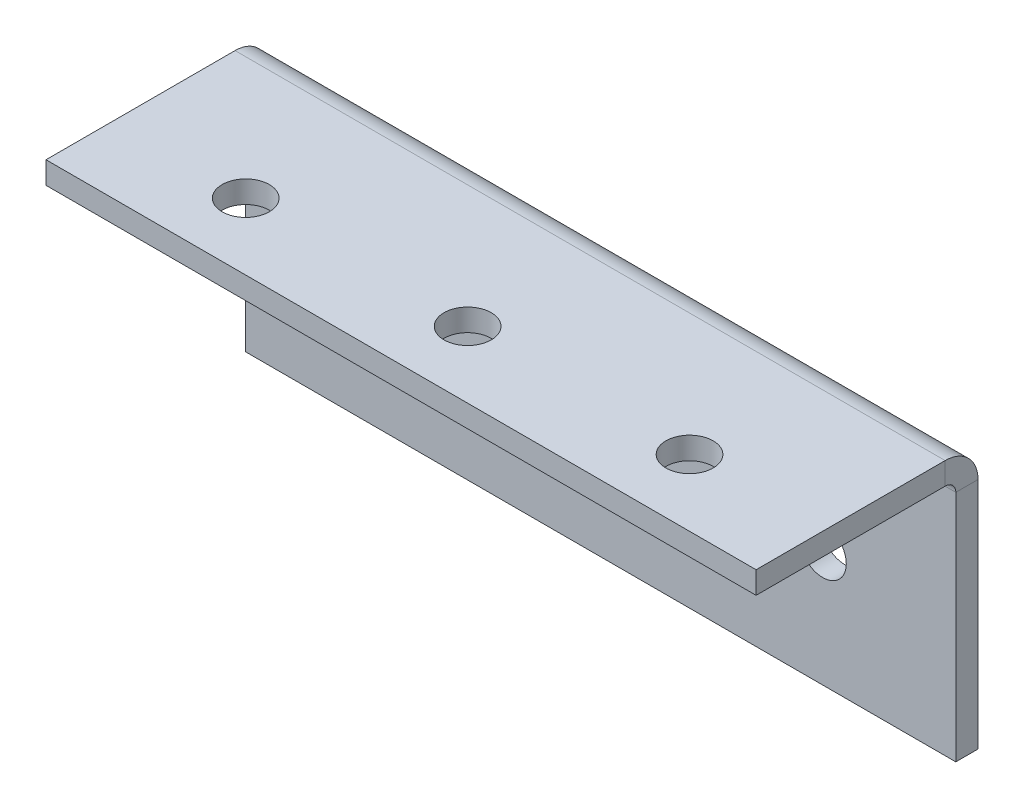
ISO-10303-21;
HEADER;
FILE_DESCRIPTION(('STEP AP214'),'2;1');
FILE_NAME('part.step','',(''),(''),'','','');
FILE_SCHEMA(('AUTOMOTIVE_DESIGN { 1 0 10303 214 1 1 1 1 }'));
ENDSEC;
DATA;
#1=APPLICATION_CONTEXT('core data for automotive mechanical design processes');
#2=APPLICATION_PROTOCOL_DEFINITION('international standard','automotive_design',2000,#1);
#3=PRODUCT_CONTEXT('',#1,'mechanical');
#4=PRODUCT('Part','Part','',(#3));
#5=PRODUCT_RELATED_PRODUCT_CATEGORY('part','',(#4));
#6=PRODUCT_DEFINITION_FORMATION('','',#4);
#7=PRODUCT_DEFINITION_CONTEXT('part definition',#1,'design');
#8=PRODUCT_DEFINITION('design','',#6,#7);
#9=PRODUCT_DEFINITION_SHAPE('','',#8);
#10=(LENGTH_UNIT() NAMED_UNIT(*) SI_UNIT(.MILLI.,.METRE.));
#11=(NAMED_UNIT(*) PLANE_ANGLE_UNIT() SI_UNIT($,.RADIAN.));
#12=(NAMED_UNIT(*) SI_UNIT($,.STERADIAN.) SOLID_ANGLE_UNIT());
#13=UNCERTAINTY_MEASURE_WITH_UNIT(LENGTH_MEASURE(1.E-05),#10,'distance_accuracy_value','');
#14=(GEOMETRIC_REPRESENTATION_CONTEXT(3) GLOBAL_UNCERTAINTY_ASSIGNED_CONTEXT((#13)) GLOBAL_UNIT_ASSIGNED_CONTEXT((#10,
#11,#12)) REPRESENTATION_CONTEXT('',''));
#15=CARTESIAN_POINT('',(0.,0.,0.));
#16=DIRECTION('',(0.,0.,1.));
#17=DIRECTION('',(1.,0.,0.));
#18=AXIS2_PLACEMENT_3D('',#15,#16,#17);
#19=CARTESIAN_POINT('',(0.,0.,-3.175));
#20=DIRECTION('',(-1.,0.,0.));
#21=DIRECTION('',(0.,-1.,0.));
#22=AXIS2_PLACEMENT_3D('',#19,#20,#21);
#23=PLANE('',#22);
#24=DIRECTION('',(0.,-1.,0.));
#25=VECTOR('',#24,1.);
#26=CARTESIAN_POINT('',(0.,0.,0.));
#27=LINE('',#26,#25);
#28=CARTESIAN_POINT('',(0.,33.401,0.));
#29=VERTEX_POINT('',#28);
#30=CARTESIAN_POINT('',(0.,0.,0.));
#31=VERTEX_POINT('',#30);
#32=EDGE_CURVE('E113',#29,#31,#27,.T.);
#33=ORIENTED_EDGE('',*,*,#32,.F.);
#34=DIRECTION('',(0.,0.,-1.));
#35=VECTOR('',#34,1.);
#36=CARTESIAN_POINT('',(0.,33.401,0.));
#37=LINE('',#36,#35);
#38=CARTESIAN_POINT('',(0.,33.401,-3.17499999999999));
#39=VERTEX_POINT('',#38);
#40=EDGE_CURVE('E122',#29,#39,#37,.T.);
#41=ORIENTED_EDGE('',*,*,#40,.T.);
#42=DIRECTION('',(0.,-1.,0.));
#43=VECTOR('',#42,1.);
#44=CARTESIAN_POINT('',(0.,0.,-3.175));
#45=LINE('',#44,#43);
#46=CARTESIAN_POINT('',(0.,0.,-3.175));
#47=VERTEX_POINT('',#46);
#48=EDGE_CURVE('E109',#39,#47,#45,.T.);
#49=ORIENTED_EDGE('',*,*,#48,.T.);
#50=DIRECTION('',(0.,0.,1.));
#51=VECTOR('',#50,1.);
#52=CARTESIAN_POINT('',(0.,0.,-3.175));
#53=LINE('',#52,#51);
#54=EDGE_CURVE('E64',#47,#31,#53,.T.);
#55=ORIENTED_EDGE('',*,*,#54,.T.);
#56=EDGE_LOOP('',(#33,#41,#49,#55));
#57=FACE_BOUND('',#56,.T.);
#58=ADVANCED_FACE('F61',(#57),#23,.T.);
#59=CARTESIAN_POINT('',(0.,0.,-3.175));
#60=DIRECTION('',(0.,0.,-1.));
#61=DIRECTION('',(-1.,0.,0.));
#62=AXIS2_PLACEMENT_3D('',#59,#60,#61);
#63=PLANE('',#62);
#64=CARTESIAN_POINT('',(82.55,16.7005,-3.175));
#65=DIRECTION('',(0.,0.,-1.));
#66=DIRECTION('',(-1.,0.,0.));
#67=AXIS2_PLACEMENT_3D('',#64,#65,#66);
#68=CIRCLE('',#67,3.37819999999999);
#69=CARTESIAN_POINT('',(79.1718,16.7005,-3.175));
#70=VERTEX_POINT('',#69);
#71=EDGE_CURVE('E207',#70,#70,#68,.T.);
#72=ORIENTED_EDGE('',*,*,#71,.F.);
#73=EDGE_LOOP('',(#72));
#74=FACE_BOUND('',#73,.T.);
#75=CARTESIAN_POINT('',(50.8,16.7005,-3.175));
#76=DIRECTION('',(0.,0.,-1.));
#77=DIRECTION('',(-1.,0.,0.));
#78=AXIS2_PLACEMENT_3D('',#75,#76,#77);
#79=CIRCLE('',#78,3.37819999999999);
#80=CARTESIAN_POINT('',(47.4218,16.7005,-3.175));
#81=VERTEX_POINT('',#80);
#82=EDGE_CURVE('E201',#81,#81,#79,.T.);
#83=ORIENTED_EDGE('',*,*,#82,.F.);
#84=EDGE_LOOP('',(#83));
#85=FACE_BOUND('',#84,.T.);
#86=CARTESIAN_POINT('',(19.05,16.7005,-3.175));
#87=DIRECTION('',(0.,0.,-1.));
#88=DIRECTION('',(-1.,0.,0.));
#89=AXIS2_PLACEMENT_3D('',#86,#87,#88);
#90=CIRCLE('',#89,3.37819999999999);
#91=CARTESIAN_POINT('',(15.6718,16.7005,-3.175));
#92=VERTEX_POINT('',#91);
#93=EDGE_CURVE('E195',#92,#92,#90,.T.);
#94=ORIENTED_EDGE('',*,*,#93,.F.);
#95=EDGE_LOOP('',(#94));
#96=FACE_BOUND('',#95,.T.);
#97=ORIENTED_EDGE('',*,*,#48,.F.);
#98=DIRECTION('',(-1.,0.,0.));
#99=VECTOR('',#98,1.);
#100=CARTESIAN_POINT('',(0.,33.401,-3.17499999999999));
#101=LINE('',#100,#99);
#102=CARTESIAN_POINT('',(101.6,33.401,-3.175));
#103=VERTEX_POINT('',#102);
#104=EDGE_CURVE('E139',#39,#103,#101,.F.);
#105=ORIENTED_EDGE('',*,*,#104,.T.);
#106=DIRECTION('',(0.,1.,0.));
#107=VECTOR('',#106,1.);
#108=CARTESIAN_POINT('',(101.6,0.,-3.175));
#109=LINE('',#108,#107);
#110=CARTESIAN_POINT('',(101.6,0.,-3.175));
#111=VERTEX_POINT('',#110);
#112=EDGE_CURVE('E118',#111,#103,#109,.T.);
#113=ORIENTED_EDGE('',*,*,#112,.F.);
#114=DIRECTION('',(1.,0.,0.));
#115=VECTOR('',#114,1.);
#116=CARTESIAN_POINT('',(0.,0.,-3.175));
#117=LINE('',#116,#115);
#118=EDGE_CURVE('E100',#47,#111,#117,.T.);
#119=ORIENTED_EDGE('',*,*,#118,.F.);
#120=EDGE_LOOP('',(#97,#105,#113,#119));
#121=FACE_BOUND('',#120,.T.);
#122=ADVANCED_FACE('F219',(#74,#85,#96,#121),#63,.T.);
#123=CARTESIAN_POINT('',(0.,0.,0.));
#124=DIRECTION('',(0.,0.,-1.));
#125=DIRECTION('',(-1.,0.,0.));
#126=AXIS2_PLACEMENT_3D('',#123,#124,#125);
#127=PLANE('',#126);
#128=CARTESIAN_POINT('',(82.55,16.7005,0.));
#129=DIRECTION('',(0.,0.,1.));
#130=DIRECTION('',(1.,0.,0.));
#131=AXIS2_PLACEMENT_3D('',#128,#129,#130);
#132=CIRCLE('',#131,3.37819999999998);
#133=CARTESIAN_POINT('',(85.9282,16.7005,0.));
#134=VERTEX_POINT('',#133);
#135=EDGE_CURVE('E210',#134,#134,#132,.T.);
#136=ORIENTED_EDGE('',*,*,#135,.F.);
#137=EDGE_LOOP('',(#136));
#138=FACE_BOUND('',#137,.T.);
#139=CARTESIAN_POINT('',(50.8,16.7005,0.));
#140=DIRECTION('',(0.,0.,1.));
#141=DIRECTION('',(1.,0.,0.));
#142=AXIS2_PLACEMENT_3D('',#139,#140,#141);
#143=CIRCLE('',#142,3.37819999999998);
#144=CARTESIAN_POINT('',(54.1782,16.7005,0.));
#145=VERTEX_POINT('',#144);
#146=EDGE_CURVE('E204',#145,#145,#143,.T.);
#147=ORIENTED_EDGE('',*,*,#146,.F.);
#148=EDGE_LOOP('',(#147));
#149=FACE_BOUND('',#148,.T.);
#150=CARTESIAN_POINT('',(19.05,16.7005,0.));
#151=DIRECTION('',(0.,0.,1.));
#152=DIRECTION('',(1.,0.,0.));
#153=AXIS2_PLACEMENT_3D('',#150,#151,#152);
#154=CIRCLE('',#153,3.37819999999999);
#155=CARTESIAN_POINT('',(22.4282,16.7005,0.));
#156=VERTEX_POINT('',#155);
#157=EDGE_CURVE('E198',#156,#156,#154,.T.);
#158=ORIENTED_EDGE('',*,*,#157,.F.);
#159=EDGE_LOOP('',(#158));
#160=FACE_BOUND('',#159,.T.);
#161=DIRECTION('',(-1.,0.,0.));
#162=VECTOR('',#161,1.);
#163=CARTESIAN_POINT('',(0.,33.401,0.));
#164=LINE('',#163,#162);
#165=CARTESIAN_POINT('',(101.6,33.401,0.));
#166=VERTEX_POINT('',#165);
#167=EDGE_CURVE('E129',#29,#166,#164,.F.);
#168=ORIENTED_EDGE('',*,*,#167,.F.);
#169=ORIENTED_EDGE('',*,*,#32,.T.);
#170=DIRECTION('',(1.,0.,0.));
#171=VECTOR('',#170,1.);
#172=CARTESIAN_POINT('',(0.,0.,0.));
#173=LINE('',#172,#171);
#174=CARTESIAN_POINT('',(101.6,0.,0.));
#175=VERTEX_POINT('',#174);
#176=EDGE_CURVE('E98',#31,#175,#173,.T.);
#177=ORIENTED_EDGE('',*,*,#176,.T.);
#178=DIRECTION('',(0.,1.,0.));
#179=VECTOR('',#178,1.);
#180=CARTESIAN_POINT('',(101.6,0.,0.));
#181=LINE('',#180,#179);
#182=EDGE_CURVE('E103',#175,#166,#181,.T.);
#183=ORIENTED_EDGE('',*,*,#182,.T.);
#184=EDGE_LOOP('',(#168,#169,#177,#183));
#185=FACE_BOUND('',#184,.T.);
#186=ADVANCED_FACE('F111',(#138,#149,#160,#185),#127,.F.);
#187=CARTESIAN_POINT('',(101.6,0.,-3.175));
#188=DIRECTION('',(1.,0.,0.));
#189=DIRECTION('',(0.,1.,0.));
#190=AXIS2_PLACEMENT_3D('',#187,#188,#189);
#191=PLANE('',#190);
#192=DIRECTION('',(0.,0.,-1.));
#193=VECTOR('',#192,1.);
#194=CARTESIAN_POINT('',(101.6,33.401,0.));
#195=LINE('',#194,#193);
#196=EDGE_CURVE('E106',#166,#103,#195,.T.);
#197=ORIENTED_EDGE('',*,*,#196,.F.);
#198=ORIENTED_EDGE('',*,*,#182,.F.);
#199=DIRECTION('',(0.,0.,1.));
#200=VECTOR('',#199,1.);
#201=CARTESIAN_POINT('',(101.6,0.,-3.175));
#202=LINE('',#201,#200);
#203=EDGE_CURVE('E13',#111,#175,#202,.T.);
#204=ORIENTED_EDGE('',*,*,#203,.F.);
#205=ORIENTED_EDGE('',*,*,#112,.T.);
#206=EDGE_LOOP('',(#197,#198,#204,#205));
#207=FACE_BOUND('',#206,.T.);
#208=ADVANCED_FACE('F104',(#207),#191,.T.);
#209=CARTESIAN_POINT('',(0.,0.,-3.175));
#210=DIRECTION('',(0.,-1.,0.));
#211=DIRECTION('',(0.,0.,-1.));
#212=AXIS2_PLACEMENT_3D('',#209,#210,#211);
#213=PLANE('',#212);
#214=ORIENTED_EDGE('',*,*,#176,.F.);
#215=ORIENTED_EDGE('',*,*,#54,.F.);
#216=ORIENTED_EDGE('',*,*,#118,.T.);
#217=ORIENTED_EDGE('',*,*,#203,.T.);
#218=EDGE_LOOP('',(#214,#215,#216,#217));
#219=FACE_BOUND('',#218,.T.);
#220=ADVANCED_FACE('F95',(#219),#213,.T.);
#221=CARTESIAN_POINT('',(101.6,33.401,1.524));
#222=DIRECTION('',(1.,0.,0.));
#223=DIRECTION('',(0.,0.,-1.));
#224=AXIS2_PLACEMENT_3D('',#221,#222,#223);
#225=PLANE('',#224);
#226=DIRECTION('',(0.,-1.,0.));
#227=VECTOR('',#226,1.);
#228=CARTESIAN_POINT('',(101.6,38.1,1.52399999999999));
#229=LINE('',#228,#227);
#230=CARTESIAN_POINT('',(101.6,34.925,1.524));
#231=VERTEX_POINT('',#230);
#232=CARTESIAN_POINT('',(101.6,38.1,1.52399999999999));
#233=VERTEX_POINT('',#232);
#234=EDGE_CURVE('E143',#231,#233,#229,.F.);
#235=ORIENTED_EDGE('',*,*,#234,.F.);
#236=CARTESIAN_POINT('',(101.6,33.401,1.524));
#237=DIRECTION('',(-1.,0.,0.));
#238=DIRECTION('',(0.,0.,1.));
#239=AXIS2_PLACEMENT_3D('',#236,#237,#238);
#240=CIRCLE('',#239,1.524);
#241=EDGE_CURVE('E133',#166,#231,#240,.F.);
#242=ORIENTED_EDGE('',*,*,#241,.F.);
#243=ORIENTED_EDGE('',*,*,#196,.T.);
#244=CARTESIAN_POINT('',(101.6,33.401,1.524));
#245=DIRECTION('',(-1.,0.,0.));
#246=DIRECTION('',(0.,0.,1.));
#247=AXIS2_PLACEMENT_3D('',#244,#245,#246);
#248=CIRCLE('',#247,4.699);
#249=EDGE_CURVE('E75',#103,#233,#248,.F.);
#250=ORIENTED_EDGE('',*,*,#249,.T.);
#251=EDGE_LOOP('',(#235,#242,#243,#250));
#252=FACE_BOUND('',#251,.T.);
#253=ADVANCED_FACE('F286',(#252),#225,.T.);
#254=CARTESIAN_POINT('',(0.,33.401,1.524));
#255=DIRECTION('',(1.,0.,0.));
#256=DIRECTION('',(0.,0.,-1.));
#257=AXIS2_PLACEMENT_3D('',#254,#255,#256);
#258=PLANE('',#257);
#259=CARTESIAN_POINT('',(0.,33.401,1.524));
#260=DIRECTION('',(-1.,0.,0.));
#261=DIRECTION('',(0.,0.,1.));
#262=AXIS2_PLACEMENT_3D('',#259,#260,#261);
#263=CIRCLE('',#262,1.524);
#264=CARTESIAN_POINT('',(0.,34.925,1.524));
#265=VERTEX_POINT('',#264);
#266=EDGE_CURVE('E126',#265,#29,#263,.T.);
#267=ORIENTED_EDGE('',*,*,#266,.F.);
#268=DIRECTION('',(0.,-1.,0.));
#269=VECTOR('',#268,1.);
#270=CARTESIAN_POINT('',(0.,34.925,1.524));
#271=LINE('',#270,#269);
#272=CARTESIAN_POINT('',(0.,38.1,1.52399999999999));
#273=VERTEX_POINT('',#272);
#274=EDGE_CURVE('E150',#265,#273,#271,.F.);
#275=ORIENTED_EDGE('',*,*,#274,.T.);
#276=CARTESIAN_POINT('',(0.,33.401,1.524));
#277=DIRECTION('',(-1.,0.,0.));
#278=DIRECTION('',(0.,0.,1.));
#279=AXIS2_PLACEMENT_3D('',#276,#277,#278);
#280=CIRCLE('',#279,4.699);
#281=EDGE_CURVE('E136',#273,#39,#280,.T.);
#282=ORIENTED_EDGE('',*,*,#281,.T.);
#283=ORIENTED_EDGE('',*,*,#40,.F.);
#284=EDGE_LOOP('',(#267,#275,#282,#283));
#285=FACE_BOUND('',#284,.T.);
#286=ADVANCED_FACE('F245',(#285),#258,.F.);
#287=CARTESIAN_POINT('',(0.,33.401,1.524));
#288=DIRECTION('',(-1.,0.,0.));
#289=DIRECTION('',(0.,1.,0.));
#290=AXIS2_PLACEMENT_3D('',#287,#288,#289);
#291=CYLINDRICAL_SURFACE('',#290,4.699);
#292=ORIENTED_EDGE('',*,*,#104,.F.);
#293=ORIENTED_EDGE('',*,*,#281,.F.);
#294=DIRECTION('',(-1.,0.,0.));
#295=VECTOR('',#294,1.);
#296=CARTESIAN_POINT('',(101.6,38.1,1.52399999999999));
#297=LINE('',#296,#295);
#298=EDGE_CURVE('E153',#273,#233,#297,.F.);
#299=ORIENTED_EDGE('',*,*,#298,.T.);
#300=ORIENTED_EDGE('',*,*,#249,.F.);
#301=EDGE_LOOP('',(#292,#293,#299,#300));
#302=FACE_BOUND('',#301,.T.);
#303=ADVANCED_FACE('F283',(#302),#291,.T.);
#304=CARTESIAN_POINT('',(0.,33.401,1.524));
#305=DIRECTION('',(-1.,0.,0.));
#306=DIRECTION('',(0.,1.,0.));
#307=AXIS2_PLACEMENT_3D('',#304,#305,#306);
#308=CYLINDRICAL_SURFACE('',#307,1.524);
#309=ORIENTED_EDGE('',*,*,#167,.T.);
#310=ORIENTED_EDGE('',*,*,#241,.T.);
#311=DIRECTION('',(-1.,0.,0.));
#312=VECTOR('',#311,1.);
#313=CARTESIAN_POINT('',(101.6,34.925,1.524));
#314=LINE('',#313,#312);
#315=EDGE_CURVE('E146',#231,#265,#314,.T.);
#316=ORIENTED_EDGE('',*,*,#315,.T.);
#317=ORIENTED_EDGE('',*,*,#266,.T.);
#318=EDGE_LOOP('',(#309,#310,#316,#317));
#319=FACE_BOUND('',#318,.T.);
#320=ADVANCED_FACE('F251',(#319),#308,.F.);
#321=CARTESIAN_POINT('',(101.6,38.1,0.));
#322=DIRECTION('',(-1.,0.,0.));
#323=DIRECTION('',(0.,0.,1.));
#324=AXIS2_PLACEMENT_3D('',#321,#322,#323);
#325=PLANE('',#324);
#326=ORIENTED_EDGE('',*,*,#234,.T.);
#327=DIRECTION('',(0.,0.,-1.));
#328=VECTOR('',#327,1.);
#329=CARTESIAN_POINT('',(101.6,38.1,-1.40611472790428E-13));
#330=LINE('',#329,#328);
#331=CARTESIAN_POINT('',(101.6,38.1000000000001,28.575));
#332=VERTEX_POINT('',#331);
#333=EDGE_CURVE('E164',#332,#233,#330,.T.);
#334=ORIENTED_EDGE('',*,*,#333,.F.);
#335=DIRECTION('',(0.,-1.,0.));
#336=VECTOR('',#335,1.);
#337=CARTESIAN_POINT('',(101.6,38.1000000000001,28.575));
#338=LINE('',#337,#336);
#339=CARTESIAN_POINT('',(101.6,34.9250000000001,28.575));
#340=VERTEX_POINT('',#339);
#341=EDGE_CURVE('E173',#332,#340,#338,.T.);
#342=ORIENTED_EDGE('',*,*,#341,.T.);
#343=DIRECTION('',(0.,0.,1.));
#344=VECTOR('',#343,1.);
#345=CARTESIAN_POINT('',(101.6,34.925,0.));
#346=LINE('',#345,#344);
#347=EDGE_CURVE('E155',#340,#231,#346,.F.);
#348=ORIENTED_EDGE('',*,*,#347,.T.);
#349=EDGE_LOOP('',(#326,#334,#342,#348));
#350=FACE_BOUND('',#349,.T.);
#351=ADVANCED_FACE('F265',(#350),#325,.F.);
#352=CARTESIAN_POINT('',(0.,38.1000000000001,28.575));
#353=DIRECTION('',(1.,0.,0.));
#354=DIRECTION('',(0.,0.,-1.));
#355=AXIS2_PLACEMENT_3D('',#352,#353,#354);
#356=PLANE('',#355);
#357=ORIENTED_EDGE('',*,*,#274,.F.);
#358=DIRECTION('',(0.,0.,-1.));
#359=VECTOR('',#358,1.);
#360=CARTESIAN_POINT('',(0.,34.9250000000001,28.575));
#361=LINE('',#360,#359);
#362=CARTESIAN_POINT('',(0.,34.9250000000001,28.575));
#363=VERTEX_POINT('',#362);
#364=EDGE_CURVE('E158',#265,#363,#361,.F.);
#365=ORIENTED_EDGE('',*,*,#364,.T.);
#366=DIRECTION('',(0.,-1.,0.));
#367=VECTOR('',#366,1.);
#368=CARTESIAN_POINT('',(0.,38.1000000000001,28.575));
#369=LINE('',#368,#367);
#370=CARTESIAN_POINT('',(0.,38.1000000000001,28.575));
#371=VERTEX_POINT('',#370);
#372=EDGE_CURVE('E130',#371,#363,#369,.T.);
#373=ORIENTED_EDGE('',*,*,#372,.F.);
#374=DIRECTION('',(0.,0.,1.));
#375=VECTOR('',#374,1.);
#376=CARTESIAN_POINT('',(0.,38.1,-1.40611472790428E-13));
#377=LINE('',#376,#375);
#378=EDGE_CURVE('E167',#273,#371,#377,.T.);
#379=ORIENTED_EDGE('',*,*,#378,.F.);
#380=EDGE_LOOP('',(#357,#365,#373,#379));
#381=FACE_BOUND('',#380,.T.);
#382=ADVANCED_FACE('F384',(#381),#356,.F.);
#383=CARTESIAN_POINT('',(0.,38.1,-1.40611472790428E-13));
#384=DIRECTION('',(0.,-1.,0.));
#385=DIRECTION('',(0.,0.,-1.));
#386=AXIS2_PLACEMENT_3D('',#383,#384,#385);
#387=PLANE('',#386);
#388=CARTESIAN_POINT('',(82.55,38.1000000000001,19.05));
#389=DIRECTION('',(0.,-1.,0.));
#390=DIRECTION('',(0.,0.,-1.));
#391=AXIS2_PLACEMENT_3D('',#388,#389,#390);
#392=CIRCLE('',#391,3.37819999999999);
#393=CARTESIAN_POINT('',(82.55,38.1000000000001,15.6718));
#394=VERTEX_POINT('',#393);
#395=EDGE_CURVE('E189',#394,#394,#392,.T.);
#396=ORIENTED_EDGE('',*,*,#395,.T.);
#397=EDGE_LOOP('',(#396));
#398=FACE_BOUND('',#397,.T.);
#399=CARTESIAN_POINT('',(50.8,38.1000000000001,19.05));
#400=DIRECTION('',(0.,-1.,0.));
#401=DIRECTION('',(0.,0.,-1.));
#402=AXIS2_PLACEMENT_3D('',#399,#400,#401);
#403=CIRCLE('',#402,3.37819999999999);
#404=CARTESIAN_POINT('',(50.8,38.1000000000001,15.6718));
#405=VERTEX_POINT('',#404);
#406=EDGE_CURVE('E183',#405,#405,#403,.T.);
#407=ORIENTED_EDGE('',*,*,#406,.T.);
#408=EDGE_LOOP('',(#407));
#409=FACE_BOUND('',#408,.T.);
#410=CARTESIAN_POINT('',(19.05,38.1000000000001,19.05));
#411=DIRECTION('',(0.,-1.,0.));
#412=DIRECTION('',(0.,0.,-1.));
#413=AXIS2_PLACEMENT_3D('',#410,#411,#412);
#414=CIRCLE('',#413,3.37819999999999);
#415=CARTESIAN_POINT('',(19.05,38.1000000000001,15.6718));
#416=VERTEX_POINT('',#415);
#417=EDGE_CURVE('E147',#416,#416,#414,.T.);
#418=ORIENTED_EDGE('',*,*,#417,.T.);
#419=EDGE_LOOP('',(#418));
#420=FACE_BOUND('',#419,.T.);
#421=ORIENTED_EDGE('',*,*,#298,.F.);
#422=ORIENTED_EDGE('',*,*,#378,.T.);
#423=DIRECTION('',(1.,0.,0.));
#424=VECTOR('',#423,1.);
#425=CARTESIAN_POINT('',(0.,38.1000000000001,28.575));
#426=LINE('',#425,#424);
#427=EDGE_CURVE('E170',#371,#332,#426,.T.);
#428=ORIENTED_EDGE('',*,*,#427,.T.);
#429=ORIENTED_EDGE('',*,*,#333,.T.);
#430=EDGE_LOOP('',(#421,#422,#428,#429));
#431=FACE_BOUND('',#430,.T.);
#432=ADVANCED_FACE('F395',(#398,#409,#420,#431),#387,.F.);
#433=CARTESIAN_POINT('',(0.,34.925,-1.29526019539602E-13));
#434=DIRECTION('',(0.,-1.,0.));
#435=DIRECTION('',(0.,0.,-1.));
#436=AXIS2_PLACEMENT_3D('',#433,#434,#435);
#437=PLANE('',#436);
#438=CARTESIAN_POINT('',(82.55,34.9250000000001,19.05));
#439=DIRECTION('',(0.,-1.,0.));
#440=DIRECTION('',(0.,0.,-1.));
#441=AXIS2_PLACEMENT_3D('',#438,#439,#440);
#442=CIRCLE('',#441,3.37819999999998);
#443=CARTESIAN_POINT('',(82.55,34.9250000000001,15.6718));
#444=VERTEX_POINT('',#443);
#445=EDGE_CURVE('E192',#444,#444,#442,.T.);
#446=ORIENTED_EDGE('',*,*,#445,.F.);
#447=EDGE_LOOP('',(#446));
#448=FACE_BOUND('',#447,.T.);
#449=CARTESIAN_POINT('',(50.8,34.9250000000001,19.05));
#450=DIRECTION('',(0.,-1.,0.));
#451=DIRECTION('',(0.,0.,-1.));
#452=AXIS2_PLACEMENT_3D('',#449,#450,#451);
#453=CIRCLE('',#452,3.37819999999998);
#454=CARTESIAN_POINT('',(50.8,34.9250000000001,15.6718));
#455=VERTEX_POINT('',#454);
#456=EDGE_CURVE('E186',#455,#455,#453,.T.);
#457=ORIENTED_EDGE('',*,*,#456,.F.);
#458=EDGE_LOOP('',(#457));
#459=FACE_BOUND('',#458,.T.);
#460=CARTESIAN_POINT('',(19.05,34.9250000000001,19.05));
#461=DIRECTION('',(0.,-1.,0.));
#462=DIRECTION('',(0.,0.,-1.));
#463=AXIS2_PLACEMENT_3D('',#460,#461,#462);
#464=CIRCLE('',#463,3.37819999999999);
#465=CARTESIAN_POINT('',(19.05,34.9250000000001,15.6718));
#466=VERTEX_POINT('',#465);
#467=EDGE_CURVE('E180',#466,#466,#464,.T.);
#468=ORIENTED_EDGE('',*,*,#467,.F.);
#469=EDGE_LOOP('',(#468));
#470=FACE_BOUND('',#469,.T.);
#471=ORIENTED_EDGE('',*,*,#364,.F.);
#472=ORIENTED_EDGE('',*,*,#315,.F.);
#473=ORIENTED_EDGE('',*,*,#347,.F.);
#474=DIRECTION('',(-1.,0.,0.));
#475=VECTOR('',#474,1.);
#476=CARTESIAN_POINT('',(101.6,34.9250000000001,28.575));
#477=LINE('',#476,#475);
#478=EDGE_CURVE('E161',#363,#340,#477,.F.);
#479=ORIENTED_EDGE('',*,*,#478,.F.);
#480=EDGE_LOOP('',(#471,#472,#473,#479));
#481=FACE_BOUND('',#480,.T.);
#482=ADVANCED_FACE('F258',(#448,#459,#470,#481),#437,.T.);
#483=CARTESIAN_POINT('',(101.6,38.1000000000001,28.575));
#484=DIRECTION('',(0.,0.,-1.));
#485=DIRECTION('',(0.,1.,0.));
#486=AXIS2_PLACEMENT_3D('',#483,#484,#485);
#487=PLANE('',#486);
#488=ORIENTED_EDGE('',*,*,#478,.T.);
#489=ORIENTED_EDGE('',*,*,#341,.F.);
#490=ORIENTED_EDGE('',*,*,#427,.F.);
#491=ORIENTED_EDGE('',*,*,#372,.T.);
#492=EDGE_LOOP('',(#488,#489,#490,#491));
#493=FACE_BOUND('',#492,.T.);
#494=ADVANCED_FACE('F273',(#493),#487,.F.);
#495=CARTESIAN_POINT('',(19.05,34.9250000000001,19.05));
#496=DIRECTION('',(0.,-1.,0.));
#497=DIRECTION('',(0.,0.,-1.));
#498=AXIS2_PLACEMENT_3D('',#495,#496,#497);
#499=CYLINDRICAL_SURFACE('',#498,3.37819999999999);
#500=ORIENTED_EDGE('',*,*,#417,.F.);
#501=EDGE_LOOP('',(#500));
#502=FACE_BOUND('',#501,.T.);
#503=ORIENTED_EDGE('',*,*,#467,.T.);
#504=EDGE_LOOP('',(#503));
#505=FACE_BOUND('',#504,.T.);
#506=ADVANCED_FACE('F428',(#502,#505),#499,.F.);
#507=CARTESIAN_POINT('',(50.8,34.9250000000001,19.05));
#508=DIRECTION('',(0.,-1.,0.));
#509=DIRECTION('',(0.,0.,-1.));
#510=AXIS2_PLACEMENT_3D('',#507,#508,#509);
#511=CYLINDRICAL_SURFACE('',#510,3.37819999999999);
#512=ORIENTED_EDGE('',*,*,#406,.F.);
#513=EDGE_LOOP('',(#512));
#514=FACE_BOUND('',#513,.T.);
#515=ORIENTED_EDGE('',*,*,#456,.T.);
#516=EDGE_LOOP('',(#515));
#517=FACE_BOUND('',#516,.T.);
#518=ADVANCED_FACE('F438',(#514,#517),#511,.F.);
#519=CARTESIAN_POINT('',(82.55,34.9250000000001,19.05));
#520=DIRECTION('',(0.,-1.,0.));
#521=DIRECTION('',(0.,0.,-1.));
#522=AXIS2_PLACEMENT_3D('',#519,#520,#521);
#523=CYLINDRICAL_SURFACE('',#522,3.37819999999999);
#524=ORIENTED_EDGE('',*,*,#395,.F.);
#525=EDGE_LOOP('',(#524));
#526=FACE_BOUND('',#525,.T.);
#527=ORIENTED_EDGE('',*,*,#445,.T.);
#528=EDGE_LOOP('',(#527));
#529=FACE_BOUND('',#528,.T.);
#530=ADVANCED_FACE('F229',(#526,#529),#523,.F.);
#531=CARTESIAN_POINT('',(19.05,16.7005,0.));
#532=DIRECTION('',(0.,0.,1.));
#533=DIRECTION('',(1.,0.,0.));
#534=AXIS2_PLACEMENT_3D('',#531,#532,#533);
#535=CYLINDRICAL_SURFACE('',#534,3.37819999999999);
#536=ORIENTED_EDGE('',*,*,#157,.T.);
#537=EDGE_LOOP('',(#536));
#538=FACE_BOUND('',#537,.T.);
#539=ORIENTED_EDGE('',*,*,#93,.T.);
#540=EDGE_LOOP('',(#539));
#541=FACE_BOUND('',#540,.T.);
#542=ADVANCED_FACE('F225',(#538,#541),#535,.F.);
#543=CARTESIAN_POINT('',(50.8,16.7005,0.));
#544=DIRECTION('',(0.,0.,1.));
#545=DIRECTION('',(1.,0.,0.));
#546=AXIS2_PLACEMENT_3D('',#543,#544,#545);
#547=CYLINDRICAL_SURFACE('',#546,3.37819999999999);
#548=ORIENTED_EDGE('',*,*,#146,.T.);
#549=EDGE_LOOP('',(#548));
#550=FACE_BOUND('',#549,.T.);
#551=ORIENTED_EDGE('',*,*,#82,.T.);
#552=EDGE_LOOP('',(#551));
#553=FACE_BOUND('',#552,.T.);
#554=ADVANCED_FACE('F228',(#550,#553),#547,.F.);
#555=CARTESIAN_POINT('',(82.55,16.7005,0.));
#556=DIRECTION('',(0.,0.,1.));
#557=DIRECTION('',(1.,0.,0.));
#558=AXIS2_PLACEMENT_3D('',#555,#556,#557);
#559=CYLINDRICAL_SURFACE('',#558,3.37819999999999);
#560=ORIENTED_EDGE('',*,*,#135,.T.);
#561=EDGE_LOOP('',(#560));
#562=FACE_BOUND('',#561,.T.);
#563=ORIENTED_EDGE('',*,*,#71,.T.);
#564=EDGE_LOOP('',(#563));
#565=FACE_BOUND('',#564,.T.);
#566=ADVANCED_FACE('F214',(#562,#565),#559,.F.);
#567=CLOSED_SHELL('',(#58,#122,#186,#208,#220,#253,#286,#303,#320,#351,#382,#432,#482,#494,#506,
#518,#530,#542,#554,#566));
#568=MANIFOLD_SOLID_BREP('B2',#567);
#569=ADVANCED_BREP_SHAPE_REPRESENTATION('',(#18,#568),#14);
#570=SHAPE_DEFINITION_REPRESENTATION(#9,#569);
ENDSEC;
END-ISO-10303-21;
